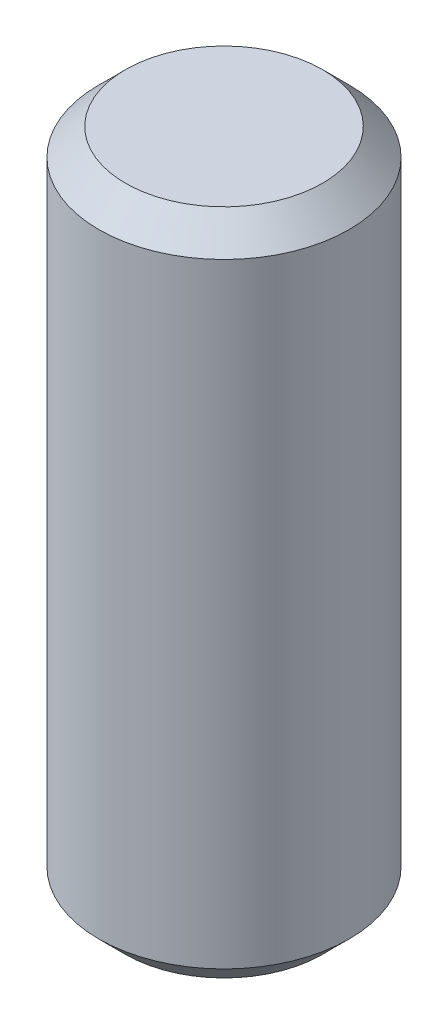
ISO-10303-21;
HEADER;
FILE_DESCRIPTION(('STEP AP214'),'2;1');
FILE_NAME('part.step','',(''),(''),'','','');
FILE_SCHEMA(('AUTOMOTIVE_DESIGN { 1 0 10303 214 1 1 1 1 }'));
ENDSEC;
DATA;
#1=APPLICATION_CONTEXT('core data for automotive mechanical design processes');
#2=APPLICATION_PROTOCOL_DEFINITION('international standard','automotive_design',2000,#1);
#3=PRODUCT_CONTEXT('',#1,'mechanical');
#4=PRODUCT('Part','Part','',(#3));
#5=PRODUCT_RELATED_PRODUCT_CATEGORY('part','',(#4));
#6=PRODUCT_DEFINITION_FORMATION('','',#4);
#7=PRODUCT_DEFINITION_CONTEXT('part definition',#1,'design');
#8=PRODUCT_DEFINITION('design','',#6,#7);
#9=PRODUCT_DEFINITION_SHAPE('','',#8);
#10=(LENGTH_UNIT() NAMED_UNIT(*) SI_UNIT(.MILLI.,.METRE.));
#11=(NAMED_UNIT(*) PLANE_ANGLE_UNIT() SI_UNIT($,.RADIAN.));
#12=(NAMED_UNIT(*) SI_UNIT($,.STERADIAN.) SOLID_ANGLE_UNIT());
#13=UNCERTAINTY_MEASURE_WITH_UNIT(LENGTH_MEASURE(1.E-05),#10,'distance_accuracy_value','');
#14=(GEOMETRIC_REPRESENTATION_CONTEXT(3) GLOBAL_UNCERTAINTY_ASSIGNED_CONTEXT((#13)) GLOBAL_UNIT_ASSIGNED_CONTEXT((#10,
#11,#12)) REPRESENTATION_CONTEXT('',''));
#15=CARTESIAN_POINT('',(0.,0.,0.));
#16=DIRECTION('',(0.,0.,1.));
#17=DIRECTION('',(1.,0.,0.));
#18=AXIS2_PLACEMENT_3D('',#15,#16,#17);
#19=CARTESIAN_POINT('',(0.,1.5875,0.));
#20=DIRECTION('',(0.,1.,0.));
#21=DIRECTION('',(-1.,0.,0.));
#22=AXIS2_PLACEMENT_3D('',#19,#20,#21);
#23=PLANE('',#22);
#24=CARTESIAN_POINT('',(0.,1.58750000002783,0.));
#25=DIRECTION('',(0.,-1.,0.));
#26=DIRECTION('',(0.,0.,-1.));
#27=AXIS2_PLACEMENT_3D('',#24,#25,#26);
#28=CIRCLE('',#27,0.468312500004231);
#29=CARTESIAN_POINT('',(0.,1.58750000002783,-0.468312500004231));
#30=VERTEX_POINT('',#29);
#31=EDGE_CURVE('E18',#30,#30,#28,.T.);
#32=ORIENTED_EDGE('',*,*,#31,.F.);
#33=EDGE_LOOP('',(#32));
#34=FACE_BOUND('',#33,.T.);
#35=ADVANCED_FACE('F15',(#34),#23,.T.);
#36=CARTESIAN_POINT('',(0.,-1.5875,0.));
#37=DIRECTION('',(0.,1.,0.));
#38=DIRECTION('',(-1.,0.,0.));
#39=AXIS2_PLACEMENT_3D('',#36,#37,#38);
#40=PLANE('',#39);
#41=CARTESIAN_POINT('',(0.,-1.58750000008467,0.));
#42=DIRECTION('',(0.,1.,0.));
#43=DIRECTION('',(0.,0.,1.));
#44=AXIS2_PLACEMENT_3D('',#41,#42,#43);
#45=CIRCLE('',#44,0.468312500061095);
#46=CARTESIAN_POINT('',(0.,-1.58750000008467,0.468312500061074));
#47=VERTEX_POINT('',#46);
#48=EDGE_CURVE('E27',#47,#47,#45,.T.);
#49=ORIENTED_EDGE('',*,*,#48,.F.);
#50=EDGE_LOOP('',(#49));
#51=FACE_BOUND('',#50,.T.);
#52=ADVANCED_FACE('F38',(#51),#40,.F.);
#53=CARTESIAN_POINT('',(0.,1.46050000006426,0.));
#54=DIRECTION('',(0.,-1.,0.));
#55=DIRECTION('',(0.,0.,-1.));
#56=AXIS2_PLACEMENT_3D('',#53,#54,#55);
#57=CONICAL_SURFACE('',#56,0.595312500024647,0.785398163621241);
#58=CARTESIAN_POINT('',(0.,1.4605,0.));
#59=DIRECTION('',(0.,-1.,0.));
#60=DIRECTION('',(1.,0.,0.));
#61=AXIS2_PLACEMENT_3D('',#58,#59,#60);
#62=CIRCLE('',#61,0.595312500000005);
#63=CARTESIAN_POINT('',(0.595312500000033,1.4605,0.));
#64=VERTEX_POINT('',#63);
#65=EDGE_CURVE('E22',#64,#64,#62,.T.);
#66=ORIENTED_EDGE('',*,*,#65,.F.);
#67=EDGE_LOOP('',(#66));
#68=FACE_BOUND('',#67,.T.);
#69=ORIENTED_EDGE('',*,*,#31,.T.);
#70=EDGE_LOOP('',(#69));
#71=FACE_BOUND('',#70,.T.);
#72=ADVANCED_FACE('F35',(#68,#71),#57,.T.);
#73=CARTESIAN_POINT('',(0.,-1.46050000006426,0.));
#74=DIRECTION('',(0.,1.,0.));
#75=DIRECTION('',(0.,0.,1.));
#76=AXIS2_PLACEMENT_3D('',#73,#74,#75);
#77=CONICAL_SURFACE('',#76,0.595312500024668,0.785398163173655);
#78=CARTESIAN_POINT('',(0.,-1.4605,0.));
#79=DIRECTION('',(0.,-1.,0.));
#80=DIRECTION('',(1.,0.,0.));
#81=AXIS2_PLACEMENT_3D('',#78,#79,#80);
#82=CIRCLE('',#81,0.595312500000005);
#83=CARTESIAN_POINT('',(0.595312500000033,-1.4605,0.));
#84=VERTEX_POINT('',#83);
#85=EDGE_CURVE('E10',#84,#84,#82,.F.);
#86=ORIENTED_EDGE('',*,*,#85,.F.);
#87=EDGE_LOOP('',(#86));
#88=FACE_BOUND('',#87,.T.);
#89=ORIENTED_EDGE('',*,*,#48,.T.);
#90=EDGE_LOOP('',(#89));
#91=FACE_BOUND('',#90,.T.);
#92=ADVANCED_FACE('F46',(#88,#91),#77,.T.);
#93=CARTESIAN_POINT('',(0.,1.5875,0.));
#94=DIRECTION('',(0.,-1.,0.));
#95=DIRECTION('',(1.,0.,0.));
#96=AXIS2_PLACEMENT_3D('',#93,#94,#95);
#97=CYLINDRICAL_SURFACE('',#96,0.595312500000005);
#98=ORIENTED_EDGE('',*,*,#85,.T.);
#99=EDGE_LOOP('',(#98));
#100=FACE_BOUND('',#99,.T.);
#101=ORIENTED_EDGE('',*,*,#65,.T.);
#102=EDGE_LOOP('',(#101));
#103=FACE_BOUND('',#102,.T.);
#104=ADVANCED_FACE('F44',(#100,#103),#97,.T.);
#105=CLOSED_SHELL('',(#35,#52,#72,#92,#104));
#106=MANIFOLD_SOLID_BREP('B1',#105);
#107=ADVANCED_BREP_SHAPE_REPRESENTATION('',(#18,#106),#14);
#108=SHAPE_DEFINITION_REPRESENTATION(#9,#107);
ENDSEC;
END-ISO-10303-21;
